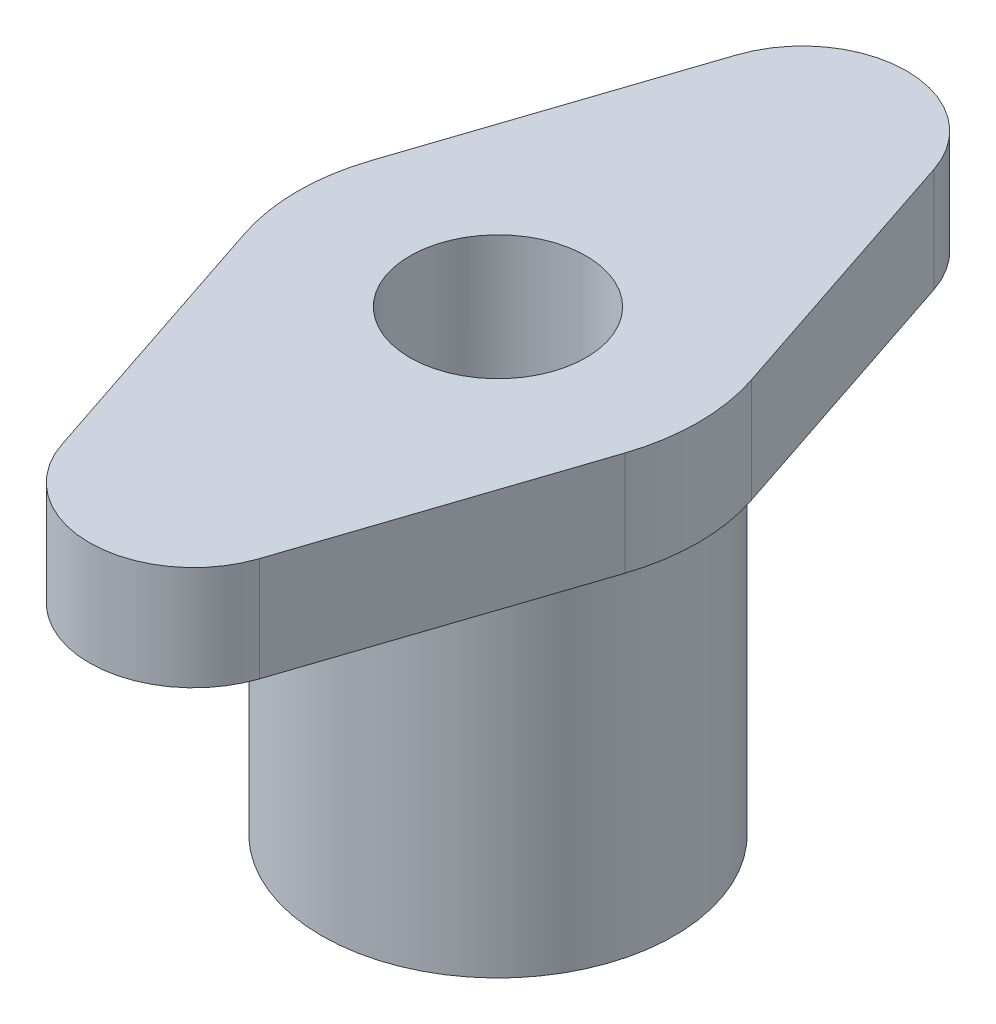
ISO-10303-21;
HEADER;
FILE_DESCRIPTION(('STEP AP214'),'2;1');
FILE_NAME('part.step','',(''),(''),'','','');
FILE_SCHEMA(('AUTOMOTIVE_DESIGN { 1 0 10303 214 1 1 1 1 }'));
ENDSEC;
DATA;
#1=APPLICATION_CONTEXT('core data for automotive mechanical design processes');
#2=APPLICATION_PROTOCOL_DEFINITION('international standard','automotive_design',2000,#1);
#3=PRODUCT_CONTEXT('',#1,'mechanical');
#4=PRODUCT('Part','Part','',(#3));
#5=PRODUCT_RELATED_PRODUCT_CATEGORY('part','',(#4));
#6=PRODUCT_DEFINITION_FORMATION('','',#4);
#7=PRODUCT_DEFINITION_CONTEXT('part definition',#1,'design');
#8=PRODUCT_DEFINITION('design','',#6,#7);
#9=PRODUCT_DEFINITION_SHAPE('','',#8);
#10=(LENGTH_UNIT() NAMED_UNIT(*) SI_UNIT(.MILLI.,.METRE.));
#11=(NAMED_UNIT(*) PLANE_ANGLE_UNIT() SI_UNIT($,.RADIAN.));
#12=(NAMED_UNIT(*) SI_UNIT($,.STERADIAN.) SOLID_ANGLE_UNIT());
#13=UNCERTAINTY_MEASURE_WITH_UNIT(LENGTH_MEASURE(1.E-05),#10,'distance_accuracy_value','');
#14=(GEOMETRIC_REPRESENTATION_CONTEXT(3) GLOBAL_UNCERTAINTY_ASSIGNED_CONTEXT((#13)) GLOBAL_UNIT_ASSIGNED_CONTEXT((#10,
#11,#12)) REPRESENTATION_CONTEXT('',''));
#15=CARTESIAN_POINT('',(0.,0.,0.));
#16=DIRECTION('',(0.,0.,1.));
#17=DIRECTION('',(1.,0.,0.));
#18=AXIS2_PLACEMENT_3D('',#15,#16,#17);
#19=CARTESIAN_POINT('',(0.,57.,0.));
#20=DIRECTION('',(0.,1.,0.));
#21=DIRECTION('',(0.,0.,1.));
#22=AXIS2_PLACEMENT_3D('',#19,#20,#21);
#23=CYLINDRICAL_SURFACE('',#22,11.);
#24=CARTESIAN_POINT('',(0.,57.,0.));
#25=DIRECTION('',(0.,1.,0.));
#26=DIRECTION('',(0.,0.,1.));
#27=AXIS2_PLACEMENT_3D('',#24,#25,#26);
#28=CIRCLE('',#27,11.);
#29=CARTESIAN_POINT('',(0.,57.,11.));
#30=VERTEX_POINT('',#29);
#31=EDGE_CURVE('E153',#30,#30,#28,.T.);
#32=ORIENTED_EDGE('',*,*,#31,.T.);
#33=EDGE_LOOP('',(#32));
#34=FACE_BOUND('',#33,.T.);
#35=CARTESIAN_POINT('',(0.,6.3508529610859,0.));
#36=DIRECTION('',(0.,-1.,0.));
#37=DIRECTION('',(0.,0.,-1.));
#38=AXIS2_PLACEMENT_3D('',#35,#36,#37);
#39=CIRCLE('',#38,11.);
#40=CARTESIAN_POINT('',(0.,6.3508529610859,-11.));
#41=VERTEX_POINT('',#40);
#42=EDGE_CURVE('E224',#41,#41,#39,.T.);
#43=ORIENTED_EDGE('',*,*,#42,.T.);
#44=EDGE_LOOP('',(#43));
#45=FACE_BOUND('',#44,.T.);
#46=ADVANCED_FACE('F45',(#34,#45),#23,.F.);
#47=CARTESIAN_POINT('',(0.,44.,0.));
#48=DIRECTION('',(0.,-1.,0.));
#49=DIRECTION('',(0.,0.,-1.));
#50=AXIS2_PLACEMENT_3D('',#47,#48,#49);
#51=CYLINDRICAL_SURFACE('',#50,22.);
#52=CARTESIAN_POINT('',(0.,44.,0.));
#53=DIRECTION('',(0.,1.,0.));
#54=DIRECTION('',(0.,0.,1.));
#55=AXIS2_PLACEMENT_3D('',#52,#53,#54);
#56=CIRCLE('',#55,22.);
#57=CARTESIAN_POINT('',(0.,44.,22.));
#58=VERTEX_POINT('',#57);
#59=EDGE_CURVE('E11',#58,#58,#56,.T.);
#60=ORIENTED_EDGE('',*,*,#59,.F.);
#61=EDGE_LOOP('',(#60));
#62=FACE_BOUND('',#61,.T.);
#63=CARTESIAN_POINT('',(0.,0.,0.));
#64=DIRECTION('',(0.,-1.,0.));
#65=DIRECTION('',(0.,0.,-1.));
#66=AXIS2_PLACEMENT_3D('',#63,#64,#65);
#67=CIRCLE('',#66,22.);
#68=CARTESIAN_POINT('',(0.,0.,-22.));
#69=VERTEX_POINT('',#68);
#70=EDGE_CURVE('E228',#69,#69,#67,.T.);
#71=ORIENTED_EDGE('',*,*,#70,.F.);
#72=EDGE_LOOP('',(#71));
#73=FACE_BOUND('',#72,.T.);
#74=ADVANCED_FACE('F47',(#62,#73),#51,.T.);
#75=CARTESIAN_POINT('',(0.,57.,0.));
#76=DIRECTION('',(0.,-1.,0.));
#77=DIRECTION('',(0.,0.,-1.));
#78=AXIS2_PLACEMENT_3D('',#75,#76,#77);
#79=CYLINDRICAL_SURFACE('',#78,25.);
#80=CARTESIAN_POINT('',(0.,44.,0.));
#81=DIRECTION('',(0.,1.,0.));
#82=DIRECTION('',(0.,0.,1.));
#83=AXIS2_PLACEMENT_3D('',#80,#81,#82);
#84=CIRCLE('',#83,25.);
#85=CARTESIAN_POINT('',(-23.720732075421,44.,-7.89473684210526));
#86=VERTEX_POINT('',#85);
#87=CARTESIAN_POINT('',(-23.720732075421,44.,7.89473684210526));
#88=VERTEX_POINT('',#87);
#89=EDGE_CURVE('E148',#86,#88,#84,.T.);
#90=ORIENTED_EDGE('',*,*,#89,.T.);
#91=DIRECTION('',(0.,-1.,0.));
#92=VECTOR('',#91,1.);
#93=CARTESIAN_POINT('',(-23.720732075421,57.,7.89473684210526));
#94=LINE('',#93,#92);
#95=CARTESIAN_POINT('',(-23.720732075421,57.,7.89473684210526));
#96=VERTEX_POINT('',#95);
#97=EDGE_CURVE('E55',#96,#88,#94,.T.);
#98=ORIENTED_EDGE('',*,*,#97,.F.);
#99=CARTESIAN_POINT('',(0.,57.,0.));
#100=DIRECTION('',(0.,1.,0.));
#101=DIRECTION('',(0.,0.,1.));
#102=AXIS2_PLACEMENT_3D('',#99,#100,#101);
#103=CIRCLE('',#102,25.);
#104=CARTESIAN_POINT('',(-23.720732075421,57.,-7.89473684210526));
#105=VERTEX_POINT('',#104);
#106=EDGE_CURVE('E171',#105,#96,#103,.T.);
#107=ORIENTED_EDGE('',*,*,#106,.F.);
#108=DIRECTION('',(0.,-1.,0.));
#109=VECTOR('',#108,1.);
#110=CARTESIAN_POINT('',(-23.720732075421,57.,-7.89473684210526));
#111=LINE('',#110,#109);
#112=EDGE_CURVE('E144',#105,#86,#111,.T.);
#113=ORIENTED_EDGE('',*,*,#112,.T.);
#114=EDGE_LOOP('',(#90,#98,#107,#113));
#115=FACE_BOUND('',#114,.T.);
#116=ADVANCED_FACE('F195',(#115),#79,.T.);
#117=CARTESIAN_POINT('',(-12.3347806792189,57.,42.1052631578947));
#118=DIRECTION('',(0.948829283016839,0.,-0.31578947368421));
#119=DIRECTION('',(-0.31578947368421,0.,-0.94882928301684));
#120=AXIS2_PLACEMENT_3D('',#117,#118,#119);
#121=PLANE('',#120);
#122=DIRECTION('',(0.31578947368421,0.,0.948829283016839));
#123=VECTOR('',#122,1.);
#124=CARTESIAN_POINT('',(-12.3347806792189,44.,42.1052631578947));
#125=LINE('',#124,#123);
#126=CARTESIAN_POINT('',(-12.3347806792189,44.,42.1052631578947));
#127=VERTEX_POINT('',#126);
#128=EDGE_CURVE('E152',#88,#127,#125,.T.);
#129=ORIENTED_EDGE('',*,*,#128,.T.);
#130=DIRECTION('',(0.,-1.,0.));
#131=VECTOR('',#130,1.);
#132=CARTESIAN_POINT('',(-12.3347806792189,57.,42.1052631578947));
#133=LINE('',#132,#131);
#134=CARTESIAN_POINT('',(-12.3347806792189,57.,42.1052631578947));
#135=VERTEX_POINT('',#134);
#136=EDGE_CURVE('E186',#135,#127,#133,.T.);
#137=ORIENTED_EDGE('',*,*,#136,.F.);
#138=DIRECTION('',(0.31578947368421,0.,0.948829283016839));
#139=VECTOR('',#138,1.);
#140=CARTESIAN_POINT('',(-12.3347806792189,57.,42.1052631578947));
#141=LINE('',#140,#139);
#142=EDGE_CURVE('E107',#96,#135,#141,.T.);
#143=ORIENTED_EDGE('',*,*,#142,.F.);
#144=ORIENTED_EDGE('',*,*,#97,.T.);
#145=EDGE_LOOP('',(#129,#137,#143,#144));
#146=FACE_BOUND('',#145,.T.);
#147=ADVANCED_FACE('F191',(#146),#121,.F.);
#148=CARTESIAN_POINT('',(0.,57.,38.));
#149=DIRECTION('',(0.,-1.,0.));
#150=DIRECTION('',(0.,0.,-1.));
#151=AXIS2_PLACEMENT_3D('',#148,#149,#150);
#152=CYLINDRICAL_SURFACE('',#151,13.);
#153=CARTESIAN_POINT('',(0.,44.,38.));
#154=DIRECTION('',(0.,1.,0.));
#155=DIRECTION('',(0.,0.,1.));
#156=AXIS2_PLACEMENT_3D('',#153,#154,#155);
#157=CIRCLE('',#156,13.);
#158=CARTESIAN_POINT('',(12.3347806792189,44.,42.1052631578947));
#159=VERTEX_POINT('',#158);
#160=EDGE_CURVE('E156',#127,#159,#157,.T.);
#161=ORIENTED_EDGE('',*,*,#160,.T.);
#162=DIRECTION('',(0.,-1.,0.));
#163=VECTOR('',#162,1.);
#164=CARTESIAN_POINT('',(12.3347806792189,57.,42.1052631578947));
#165=LINE('',#164,#163);
#166=CARTESIAN_POINT('',(12.3347806792189,57.,42.1052631578947));
#167=VERTEX_POINT('',#166);
#168=EDGE_CURVE('E182',#167,#159,#165,.T.);
#169=ORIENTED_EDGE('',*,*,#168,.F.);
#170=CARTESIAN_POINT('',(0.,57.,38.));
#171=DIRECTION('',(0.,1.,0.));
#172=DIRECTION('',(0.,0.,1.));
#173=AXIS2_PLACEMENT_3D('',#170,#171,#172);
#174=CIRCLE('',#173,13.);
#175=EDGE_CURVE('E211',#135,#167,#174,.T.);
#176=ORIENTED_EDGE('',*,*,#175,.F.);
#177=ORIENTED_EDGE('',*,*,#136,.T.);
#178=EDGE_LOOP('',(#161,#169,#176,#177));
#179=FACE_BOUND('',#178,.T.);
#180=ADVANCED_FACE('F203',(#179),#152,.T.);
#181=CARTESIAN_POINT('',(12.3347806792189,57.,42.1052631578947));
#182=DIRECTION('',(-0.948829283016839,0.,-0.31578947368421));
#183=DIRECTION('',(-0.31578947368421,0.,0.94882928301684));
#184=AXIS2_PLACEMENT_3D('',#181,#182,#183);
#185=PLANE('',#184);
#186=DIRECTION('',(0.31578947368421,0.,-0.948829283016839));
#187=VECTOR('',#186,1.);
#188=CARTESIAN_POINT('',(12.3347806792189,44.,42.1052631578947));
#189=LINE('',#188,#187);
#190=CARTESIAN_POINT('',(23.720732075421,44.,7.89473684210526));
#191=VERTEX_POINT('',#190);
#192=EDGE_CURVE('E159',#159,#191,#189,.T.);
#193=ORIENTED_EDGE('',*,*,#192,.T.);
#194=DIRECTION('',(0.,-1.,0.));
#195=VECTOR('',#194,1.);
#196=CARTESIAN_POINT('',(23.720732075421,57.,7.89473684210526));
#197=LINE('',#196,#195);
#198=CARTESIAN_POINT('',(23.720732075421,57.,7.89473684210526));
#199=VERTEX_POINT('',#198);
#200=EDGE_CURVE('E178',#199,#191,#197,.T.);
#201=ORIENTED_EDGE('',*,*,#200,.F.);
#202=DIRECTION('',(0.31578947368421,0.,-0.948829283016839));
#203=VECTOR('',#202,1.);
#204=CARTESIAN_POINT('',(12.3347806792189,57.,42.1052631578947));
#205=LINE('',#204,#203);
#206=EDGE_CURVE('E209',#167,#199,#205,.T.);
#207=ORIENTED_EDGE('',*,*,#206,.F.);
#208=ORIENTED_EDGE('',*,*,#168,.T.);
#209=EDGE_LOOP('',(#193,#201,#207,#208));
#210=FACE_BOUND('',#209,.T.);
#211=ADVANCED_FACE('F207',(#210),#185,.F.);
#212=CARTESIAN_POINT('',(0.,57.,0.));
#213=DIRECTION('',(0.,-1.,0.));
#214=DIRECTION('',(0.,0.,-1.));
#215=AXIS2_PLACEMENT_3D('',#212,#213,#214);
#216=CYLINDRICAL_SURFACE('',#215,25.);
#217=CARTESIAN_POINT('',(0.,44.,0.));
#218=DIRECTION('',(0.,1.,0.));
#219=DIRECTION('',(0.,0.,1.));
#220=AXIS2_PLACEMENT_3D('',#217,#218,#219);
#221=CIRCLE('',#220,25.);
#222=CARTESIAN_POINT('',(23.720732075421,44.,-7.89473684210526));
#223=VERTEX_POINT('',#222);
#224=EDGE_CURVE('E162',#191,#223,#221,.T.);
#225=ORIENTED_EDGE('',*,*,#224,.T.);
#226=DIRECTION('',(0.,-1.,0.));
#227=VECTOR('',#226,1.);
#228=CARTESIAN_POINT('',(23.720732075421,57.,-7.89473684210526));
#229=LINE('',#228,#227);
#230=CARTESIAN_POINT('',(23.720732075421,57.,-7.89473684210526));
#231=VERTEX_POINT('',#230);
#232=EDGE_CURVE('E137',#231,#223,#229,.T.);
#233=ORIENTED_EDGE('',*,*,#232,.F.);
#234=CARTESIAN_POINT('',(0.,57.,0.));
#235=DIRECTION('',(0.,1.,0.));
#236=DIRECTION('',(0.,0.,1.));
#237=AXIS2_PLACEMENT_3D('',#234,#235,#236);
#238=CIRCLE('',#237,25.);
#239=EDGE_CURVE('E126',#199,#231,#238,.T.);
#240=ORIENTED_EDGE('',*,*,#239,.F.);
#241=ORIENTED_EDGE('',*,*,#200,.T.);
#242=EDGE_LOOP('',(#225,#233,#240,#241));
#243=FACE_BOUND('',#242,.T.);
#244=ADVANCED_FACE('F263',(#243),#216,.T.);
#245=CARTESIAN_POINT('',(12.3347806792189,57.,-42.1052631578947));
#246=DIRECTION('',(-0.948829283016839,0.,0.31578947368421));
#247=DIRECTION('',(0.31578947368421,0.,0.94882928301684));
#248=AXIS2_PLACEMENT_3D('',#245,#246,#247);
#249=PLANE('',#248);
#250=DIRECTION('',(-0.31578947368421,0.,-0.948829283016839));
#251=VECTOR('',#250,1.);
#252=CARTESIAN_POINT('',(12.3347806792189,44.,-42.1052631578947));
#253=LINE('',#252,#251);
#254=CARTESIAN_POINT('',(12.3347806792189,44.,-42.1052631578947));
#255=VERTEX_POINT('',#254);
#256=EDGE_CURVE('E135',#223,#255,#253,.T.);
#257=ORIENTED_EDGE('',*,*,#256,.T.);
#258=DIRECTION('',(0.,-1.,0.));
#259=VECTOR('',#258,1.);
#260=CARTESIAN_POINT('',(12.3347806792189,57.,-42.1052631578947));
#261=LINE('',#260,#259);
#262=CARTESIAN_POINT('',(12.3347806792189,57.,-42.1052631578947));
#263=VERTEX_POINT('',#262);
#264=EDGE_CURVE('E132',#263,#255,#261,.T.);
#265=ORIENTED_EDGE('',*,*,#264,.F.);
#266=DIRECTION('',(-0.31578947368421,0.,-0.948829283016839));
#267=VECTOR('',#266,1.);
#268=CARTESIAN_POINT('',(12.3347806792189,57.,-42.1052631578947));
#269=LINE('',#268,#267);
#270=EDGE_CURVE('E120',#231,#263,#269,.T.);
#271=ORIENTED_EDGE('',*,*,#270,.F.);
#272=ORIENTED_EDGE('',*,*,#232,.T.);
#273=EDGE_LOOP('',(#257,#265,#271,#272));
#274=FACE_BOUND('',#273,.T.);
#275=ADVANCED_FACE('F133',(#274),#249,.F.);
#276=CARTESIAN_POINT('',(0.,57.,-38.));
#277=DIRECTION('',(0.,-1.,0.));
#278=DIRECTION('',(0.,0.,-1.));
#279=AXIS2_PLACEMENT_3D('',#276,#277,#278);
#280=CYLINDRICAL_SURFACE('',#279,13.);
#281=CARTESIAN_POINT('',(0.,44.,-38.));
#282=DIRECTION('',(0.,1.,0.));
#283=DIRECTION('',(0.,0.,1.));
#284=AXIS2_PLACEMENT_3D('',#281,#282,#283);
#285=CIRCLE('',#284,13.);
#286=CARTESIAN_POINT('',(-12.3347806792189,44.,-42.1052631578947));
#287=VERTEX_POINT('',#286);
#288=EDGE_CURVE('E92',#255,#287,#285,.T.);
#289=ORIENTED_EDGE('',*,*,#288,.T.);
#290=DIRECTION('',(0.,-1.,0.));
#291=VECTOR('',#290,1.);
#292=CARTESIAN_POINT('',(-12.3347806792189,57.,-42.1052631578947));
#293=LINE('',#292,#291);
#294=CARTESIAN_POINT('',(-12.3347806792189,57.,-42.1052631578947));
#295=VERTEX_POINT('',#294);
#296=EDGE_CURVE('E138',#295,#287,#293,.T.);
#297=ORIENTED_EDGE('',*,*,#296,.F.);
#298=CARTESIAN_POINT('',(0.,57.,-38.));
#299=DIRECTION('',(0.,1.,0.));
#300=DIRECTION('',(0.,0.,1.));
#301=AXIS2_PLACEMENT_3D('',#298,#299,#300);
#302=CIRCLE('',#301,13.);
#303=EDGE_CURVE('E124',#263,#295,#302,.T.);
#304=ORIENTED_EDGE('',*,*,#303,.F.);
#305=ORIENTED_EDGE('',*,*,#264,.T.);
#306=EDGE_LOOP('',(#289,#297,#304,#305));
#307=FACE_BOUND('',#306,.T.);
#308=ADVANCED_FACE('F140',(#307),#280,.T.);
#309=CARTESIAN_POINT('',(-12.3347806792189,57.,-42.1052631578947));
#310=DIRECTION('',(0.948829283016839,0.,0.31578947368421));
#311=DIRECTION('',(0.31578947368421,0.,-0.94882928301684));
#312=AXIS2_PLACEMENT_3D('',#309,#310,#311);
#313=PLANE('',#312);
#314=DIRECTION('',(-0.31578947368421,0.,0.948829283016839));
#315=VECTOR('',#314,1.);
#316=CARTESIAN_POINT('',(-12.3347806792189,44.,-42.1052631578947));
#317=LINE('',#316,#315);
#318=EDGE_CURVE('E98',#287,#86,#317,.T.);
#319=ORIENTED_EDGE('',*,*,#318,.T.);
#320=ORIENTED_EDGE('',*,*,#112,.F.);
#321=DIRECTION('',(-0.31578947368421,0.,0.948829283016839));
#322=VECTOR('',#321,1.);
#323=CARTESIAN_POINT('',(-12.3347806792189,57.,-42.1052631578947));
#324=LINE('',#323,#322);
#325=EDGE_CURVE('E63',#295,#105,#324,.T.);
#326=ORIENTED_EDGE('',*,*,#325,.F.);
#327=ORIENTED_EDGE('',*,*,#296,.T.);
#328=EDGE_LOOP('',(#319,#320,#326,#327));
#329=FACE_BOUND('',#328,.T.);
#330=ADVANCED_FACE('F254',(#329),#313,.F.);
#331=CARTESIAN_POINT('',(0.,57.,0.));
#332=DIRECTION('',(0.,1.,0.));
#333=DIRECTION('',(0.,0.,1.));
#334=AXIS2_PLACEMENT_3D('',#331,#332,#333);
#335=PLANE('',#334);
#336=ORIENTED_EDGE('',*,*,#31,.F.);
#337=EDGE_LOOP('',(#336));
#338=FACE_BOUND('',#337,.T.);
#339=ORIENTED_EDGE('',*,*,#106,.T.);
#340=ORIENTED_EDGE('',*,*,#142,.T.);
#341=ORIENTED_EDGE('',*,*,#175,.T.);
#342=ORIENTED_EDGE('',*,*,#206,.T.);
#343=ORIENTED_EDGE('',*,*,#239,.T.);
#344=ORIENTED_EDGE('',*,*,#270,.T.);
#345=ORIENTED_EDGE('',*,*,#303,.T.);
#346=ORIENTED_EDGE('',*,*,#325,.T.);
#347=EDGE_LOOP('',(#339,#340,#341,#342,#343,#344,#345,#346));
#348=FACE_BOUND('',#347,.T.);
#349=ADVANCED_FACE('F122',(#338,#348),#335,.T.);
#350=CARTESIAN_POINT('',(0.,44.,0.));
#351=DIRECTION('',(0.,1.,0.));
#352=DIRECTION('',(0.,0.,1.));
#353=AXIS2_PLACEMENT_3D('',#350,#351,#352);
#354=PLANE('',#353);
#355=ORIENTED_EDGE('',*,*,#59,.T.);
#356=EDGE_LOOP('',(#355));
#357=FACE_BOUND('',#356,.T.);
#358=ORIENTED_EDGE('',*,*,#89,.F.);
#359=ORIENTED_EDGE('',*,*,#318,.F.);
#360=ORIENTED_EDGE('',*,*,#288,.F.);
#361=ORIENTED_EDGE('',*,*,#256,.F.);
#362=ORIENTED_EDGE('',*,*,#224,.F.);
#363=ORIENTED_EDGE('',*,*,#192,.F.);
#364=ORIENTED_EDGE('',*,*,#160,.F.);
#365=ORIENTED_EDGE('',*,*,#128,.F.);
#366=EDGE_LOOP('',(#358,#359,#360,#361,#362,#363,#364,#365));
#367=FACE_BOUND('',#366,.T.);
#368=ADVANCED_FACE('F197',(#357,#367),#354,.F.);
#369=CARTESIAN_POINT('',(0.,6.3508529610859,0.));
#370=DIRECTION('',(0.,-1.,0.));
#371=DIRECTION('',(0.,0.,-1.));
#372=AXIS2_PLACEMENT_3D('',#369,#370,#371);
#373=CONICAL_SURFACE('',#372,11.,1.0471975511966);
#374=ORIENTED_EDGE('',*,*,#70,.T.);
#375=EDGE_LOOP('',(#374));
#376=FACE_BOUND('',#375,.T.);
#377=ORIENTED_EDGE('',*,*,#42,.F.);
#378=EDGE_LOOP('',(#377));
#379=FACE_BOUND('',#378,.T.);
#380=ADVANCED_FACE('F233',(#376,#379),#373,.F.);
#381=CLOSED_SHELL('',(#46,#74,#116,#147,#180,#211,#244,#275,#308,#330,#349,#368,#380));
#382=MANIFOLD_SOLID_BREP('B2',#381);
#383=ADVANCED_BREP_SHAPE_REPRESENTATION('',(#18,#382),#14);
#384=SHAPE_DEFINITION_REPRESENTATION(#9,#383);
ENDSEC;
END-ISO-10303-21;
